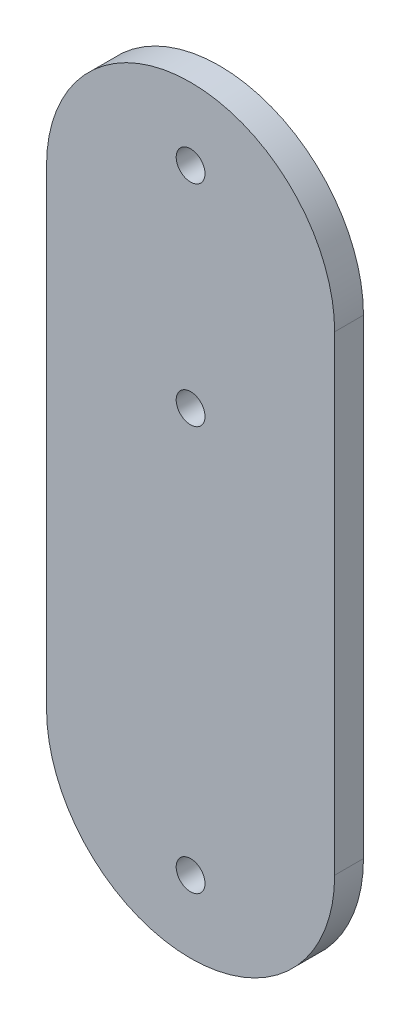
ISO-10303-21;
HEADER;
FILE_DESCRIPTION(('STEP AP214'),'2;1');
FILE_NAME('part.step','',(''),(''),'','','');
FILE_SCHEMA(('AUTOMOTIVE_DESIGN { 1 0 10303 214 1 1 1 1 }'));
ENDSEC;
DATA;
#1=APPLICATION_CONTEXT('core data for automotive mechanical design processes');
#2=APPLICATION_PROTOCOL_DEFINITION('international standard','automotive_design',2000,#1);
#3=PRODUCT_CONTEXT('',#1,'mechanical');
#4=PRODUCT('Part','Part','',(#3));
#5=PRODUCT_RELATED_PRODUCT_CATEGORY('part','',(#4));
#6=PRODUCT_DEFINITION_FORMATION('','',#4);
#7=PRODUCT_DEFINITION_CONTEXT('part definition',#1,'design');
#8=PRODUCT_DEFINITION('design','',#6,#7);
#9=PRODUCT_DEFINITION_SHAPE('','',#8);
#10=(LENGTH_UNIT() NAMED_UNIT(*) SI_UNIT(.MILLI.,.METRE.));
#11=(NAMED_UNIT(*) PLANE_ANGLE_UNIT() SI_UNIT($,.RADIAN.));
#12=(NAMED_UNIT(*) SI_UNIT($,.STERADIAN.) SOLID_ANGLE_UNIT());
#13=UNCERTAINTY_MEASURE_WITH_UNIT(LENGTH_MEASURE(1.E-05),#10,'distance_accuracy_value','');
#14=(GEOMETRIC_REPRESENTATION_CONTEXT(3) GLOBAL_UNCERTAINTY_ASSIGNED_CONTEXT((#13)) GLOBAL_UNIT_ASSIGNED_CONTEXT((#10,
#11,#12)) REPRESENTATION_CONTEXT('',''));
#15=CARTESIAN_POINT('',(0.,0.,0.));
#16=DIRECTION('',(0.,0.,1.));
#17=DIRECTION('',(1.,0.,0.));
#18=AXIS2_PLACEMENT_3D('',#15,#16,#17);
#19=CARTESIAN_POINT('',(10.,44.7499999999967,3.));
#20=DIRECTION('',(0.,0.,1.));
#21=DIRECTION('',(1.,0.,0.));
#22=AXIS2_PLACEMENT_3D('',#19,#20,#21);
#23=PLANE('',#22);
#24=CARTESIAN_POINT('',(10.,-11.75,3.));
#25=DIRECTION('',(0.,0.,1.));
#26=DIRECTION('',(1.,0.,0.));
#27=AXIS2_PLACEMENT_3D('',#24,#25,#26);
#28=CIRCLE('',#27,1.5);
#29=CARTESIAN_POINT('',(11.5,-11.75,3.));
#30=VERTEX_POINT('',#29);
#31=EDGE_CURVE('E119',#30,#30,#28,.T.);
#32=ORIENTED_EDGE('',*,*,#31,.F.);
#33=EDGE_LOOP('',(#32));
#34=FACE_BOUND('',#33,.T.);
#35=CARTESIAN_POINT('',(10.,44.7499999999967,3.));
#36=DIRECTION('',(0.,0.,1.));
#37=DIRECTION('',(1.,0.,0.));
#38=AXIS2_PLACEMENT_3D('',#35,#36,#37);
#39=CIRCLE('',#38,15.);
#40=CARTESIAN_POINT('',(25.,44.75,3.));
#41=VERTEX_POINT('',#40);
#42=CARTESIAN_POINT('',(-5.,44.75,3.));
#43=VERTEX_POINT('',#42);
#44=EDGE_CURVE('E89',#41,#43,#39,.T.);
#45=ORIENTED_EDGE('',*,*,#44,.T.);
#46=DIRECTION('',(0.,-1.,0.));
#47=VECTOR('',#46,1.);
#48=CARTESIAN_POINT('',(-5.,44.75,3.));
#49=LINE('',#48,#47);
#50=CARTESIAN_POINT('',(-4.99999999999999,-4.25,3.));
#51=VERTEX_POINT('',#50);
#52=EDGE_CURVE('E84',#43,#51,#49,.T.);
#53=ORIENTED_EDGE('',*,*,#52,.T.);
#54=CARTESIAN_POINT('',(10.,-4.24999999997817,3.));
#55=DIRECTION('',(0.,0.,1.));
#56=DIRECTION('',(1.,0.,0.));
#57=AXIS2_PLACEMENT_3D('',#54,#55,#56);
#58=CIRCLE('',#57,15.);
#59=CARTESIAN_POINT('',(25.,-4.25,3.));
#60=VERTEX_POINT('',#59);
#61=EDGE_CURVE('E87',#51,#60,#58,.T.);
#62=ORIENTED_EDGE('',*,*,#61,.T.);
#63=DIRECTION('',(0.,1.,0.));
#64=VECTOR('',#63,1.);
#65=CARTESIAN_POINT('',(25.,44.75,3.));
#66=LINE('',#65,#64);
#67=EDGE_CURVE('E54',#60,#41,#66,.T.);
#68=ORIENTED_EDGE('',*,*,#67,.T.);
#69=EDGE_LOOP('',(#45,#53,#62,#68));
#70=FACE_BOUND('',#69,.T.);
#71=CARTESIAN_POINT('',(10.,52.25,3.));
#72=DIRECTION('',(0.,0.,1.));
#73=DIRECTION('',(1.,0.,0.));
#74=AXIS2_PLACEMENT_3D('',#71,#72,#73);
#75=CIRCLE('',#74,1.5);
#76=CARTESIAN_POINT('',(11.5,52.25,3.));
#77=VERTEX_POINT('',#76);
#78=EDGE_CURVE('E104',#77,#77,#75,.T.);
#79=ORIENTED_EDGE('',*,*,#78,.F.);
#80=EDGE_LOOP('',(#79));
#81=FACE_BOUND('',#80,.T.);
#82=CARTESIAN_POINT('',(9.99999999999545,30.3600000000003,3.));
#83=DIRECTION('',(0.,0.,1.));
#84=DIRECTION('',(1.,0.,0.));
#85=AXIS2_PLACEMENT_3D('',#82,#83,#84);
#86=CIRCLE('',#85,1.5);
#87=CARTESIAN_POINT('',(11.4999999999955,30.3600000000003,3.));
#88=VERTEX_POINT('',#87);
#89=EDGE_CURVE('E125',#88,#88,#86,.T.);
#90=ORIENTED_EDGE('',*,*,#89,.F.);
#91=EDGE_LOOP('',(#90));
#92=FACE_BOUND('',#91,.T.);
#93=ADVANCED_FACE('F37',(#34,#70,#81,#92),#23,.T.);
#94=CARTESIAN_POINT('',(10.,44.7499999999967,0.));
#95=DIRECTION('',(0.,0.,1.));
#96=DIRECTION('',(1.,0.,0.));
#97=AXIS2_PLACEMENT_3D('',#94,#95,#96);
#98=PLANE('',#97);
#99=CARTESIAN_POINT('',(10.,-11.75,0.));
#100=DIRECTION('',(0.,0.,1.));
#101=DIRECTION('',(1.,0.,0.));
#102=AXIS2_PLACEMENT_3D('',#99,#100,#101);
#103=CIRCLE('',#102,1.5);
#104=CARTESIAN_POINT('',(11.5,-11.75,0.));
#105=VERTEX_POINT('',#104);
#106=EDGE_CURVE('E122',#105,#105,#103,.T.);
#107=ORIENTED_EDGE('',*,*,#106,.T.);
#108=EDGE_LOOP('',(#107));
#109=FACE_BOUND('',#108,.T.);
#110=CARTESIAN_POINT('',(10.,44.7499999999967,0.));
#111=DIRECTION('',(0.,0.,1.));
#112=DIRECTION('',(1.,0.,0.));
#113=AXIS2_PLACEMENT_3D('',#110,#111,#112);
#114=CIRCLE('',#113,15.);
#115=CARTESIAN_POINT('',(25.,44.75,0.));
#116=VERTEX_POINT('',#115);
#117=CARTESIAN_POINT('',(-5.,44.75,0.));
#118=VERTEX_POINT('',#117);
#119=EDGE_CURVE('E101',#116,#118,#114,.T.);
#120=ORIENTED_EDGE('',*,*,#119,.F.);
#121=DIRECTION('',(0.,1.,0.));
#122=VECTOR('',#121,1.);
#123=CARTESIAN_POINT('',(25.,44.75,0.));
#124=LINE('',#123,#122);
#125=CARTESIAN_POINT('',(25.,-4.25,0.));
#126=VERTEX_POINT('',#125);
#127=EDGE_CURVE('E77',#126,#116,#124,.T.);
#128=ORIENTED_EDGE('',*,*,#127,.F.);
#129=CARTESIAN_POINT('',(10.,-4.24999999997817,0.));
#130=DIRECTION('',(0.,0.,1.));
#131=DIRECTION('',(1.,0.,0.));
#132=AXIS2_PLACEMENT_3D('',#129,#130,#131);
#133=CIRCLE('',#132,15.);
#134=CARTESIAN_POINT('',(-4.99999999999999,-4.25,0.));
#135=VERTEX_POINT('',#134);
#136=EDGE_CURVE('E71',#135,#126,#133,.T.);
#137=ORIENTED_EDGE('',*,*,#136,.F.);
#138=DIRECTION('',(0.,-1.,0.));
#139=VECTOR('',#138,1.);
#140=CARTESIAN_POINT('',(-5.,44.75,0.));
#141=LINE('',#140,#139);
#142=EDGE_CURVE('E93',#118,#135,#141,.T.);
#143=ORIENTED_EDGE('',*,*,#142,.F.);
#144=EDGE_LOOP('',(#120,#128,#137,#143));
#145=FACE_BOUND('',#144,.T.);
#146=CARTESIAN_POINT('',(10.,52.25,0.));
#147=DIRECTION('',(0.,0.,1.));
#148=DIRECTION('',(1.,0.,0.));
#149=AXIS2_PLACEMENT_3D('',#146,#147,#148);
#150=CIRCLE('',#149,1.5);
#151=CARTESIAN_POINT('',(11.5,52.25,0.));
#152=VERTEX_POINT('',#151);
#153=EDGE_CURVE('E116',#152,#152,#150,.T.);
#154=ORIENTED_EDGE('',*,*,#153,.T.);
#155=EDGE_LOOP('',(#154));
#156=FACE_BOUND('',#155,.T.);
#157=CARTESIAN_POINT('',(9.99999999999545,30.3600000000003,0.));
#158=DIRECTION('',(0.,0.,1.));
#159=DIRECTION('',(1.,0.,0.));
#160=AXIS2_PLACEMENT_3D('',#157,#158,#159);
#161=CIRCLE('',#160,1.5);
#162=CARTESIAN_POINT('',(11.4999999999955,30.3600000000003,0.));
#163=VERTEX_POINT('',#162);
#164=EDGE_CURVE('E128',#163,#163,#161,.T.);
#165=ORIENTED_EDGE('',*,*,#164,.T.);
#166=EDGE_LOOP('',(#165));
#167=FACE_BOUND('',#166,.T.);
#168=ADVANCED_FACE('F112',(#109,#145,#156,#167),#98,.F.);
#169=CARTESIAN_POINT('',(10.,44.7499999999967,3.));
#170=DIRECTION('',(0.,0.,-1.));
#171=DIRECTION('',(-1.,0.,0.));
#172=AXIS2_PLACEMENT_3D('',#169,#170,#171);
#173=CYLINDRICAL_SURFACE('',#172,15.);
#174=ORIENTED_EDGE('',*,*,#119,.T.);
#175=DIRECTION('',(0.,0.,-1.));
#176=VECTOR('',#175,1.);
#177=CARTESIAN_POINT('',(-5.,44.75,3.));
#178=LINE('',#177,#176);
#179=EDGE_CURVE('E11',#43,#118,#178,.T.);
#180=ORIENTED_EDGE('',*,*,#179,.F.);
#181=ORIENTED_EDGE('',*,*,#44,.F.);
#182=DIRECTION('',(0.,0.,-1.));
#183=VECTOR('',#182,1.);
#184=CARTESIAN_POINT('',(25.,44.75,3.));
#185=LINE('',#184,#183);
#186=EDGE_CURVE('E97',#41,#116,#185,.T.);
#187=ORIENTED_EDGE('',*,*,#186,.T.);
#188=EDGE_LOOP('',(#174,#180,#181,#187));
#189=FACE_BOUND('',#188,.T.);
#190=ADVANCED_FACE('F39',(#189),#173,.T.);
#191=CARTESIAN_POINT('',(-5.,44.75,3.));
#192=DIRECTION('',(1.,0.,0.));
#193=DIRECTION('',(0.,0.,-1.));
#194=AXIS2_PLACEMENT_3D('',#191,#192,#193);
#195=PLANE('',#194);
#196=ORIENTED_EDGE('',*,*,#142,.T.);
#197=DIRECTION('',(0.,0.,-1.));
#198=VECTOR('',#197,1.);
#199=CARTESIAN_POINT('',(-4.99999999999999,-4.25,3.));
#200=LINE('',#199,#198);
#201=EDGE_CURVE('E46',#51,#135,#200,.T.);
#202=ORIENTED_EDGE('',*,*,#201,.F.);
#203=ORIENTED_EDGE('',*,*,#52,.F.);
#204=ORIENTED_EDGE('',*,*,#179,.T.);
#205=EDGE_LOOP('',(#196,#202,#203,#204));
#206=FACE_BOUND('',#205,.T.);
#207=ADVANCED_FACE('F92',(#206),#195,.F.);
#208=CARTESIAN_POINT('',(10.,-4.24999999997817,3.));
#209=DIRECTION('',(0.,0.,-1.));
#210=DIRECTION('',(-1.,0.,0.));
#211=AXIS2_PLACEMENT_3D('',#208,#209,#210);
#212=CYLINDRICAL_SURFACE('',#211,15.);
#213=ORIENTED_EDGE('',*,*,#136,.T.);
#214=DIRECTION('',(0.,0.,-1.));
#215=VECTOR('',#214,1.);
#216=CARTESIAN_POINT('',(25.,-4.25,3.));
#217=LINE('',#216,#215);
#218=EDGE_CURVE('E94',#60,#126,#217,.T.);
#219=ORIENTED_EDGE('',*,*,#218,.F.);
#220=ORIENTED_EDGE('',*,*,#61,.F.);
#221=ORIENTED_EDGE('',*,*,#201,.T.);
#222=EDGE_LOOP('',(#213,#219,#220,#221));
#223=FACE_BOUND('',#222,.T.);
#224=ADVANCED_FACE('F95',(#223),#212,.T.);
#225=CARTESIAN_POINT('',(25.,44.75,3.));
#226=DIRECTION('',(-1.,0.,0.));
#227=DIRECTION('',(0.,0.,1.));
#228=AXIS2_PLACEMENT_3D('',#225,#226,#227);
#229=PLANE('',#228);
#230=ORIENTED_EDGE('',*,*,#127,.T.);
#231=ORIENTED_EDGE('',*,*,#186,.F.);
#232=ORIENTED_EDGE('',*,*,#67,.F.);
#233=ORIENTED_EDGE('',*,*,#218,.T.);
#234=EDGE_LOOP('',(#230,#231,#232,#233));
#235=FACE_BOUND('',#234,.T.);
#236=ADVANCED_FACE('F109',(#235),#229,.F.);
#237=CARTESIAN_POINT('',(10.,52.25,3.));
#238=DIRECTION('',(0.,0.,-1.));
#239=DIRECTION('',(-1.,0.,0.));
#240=AXIS2_PLACEMENT_3D('',#237,#238,#239);
#241=CYLINDRICAL_SURFACE('',#240,1.5);
#242=ORIENTED_EDGE('',*,*,#78,.T.);
#243=EDGE_LOOP('',(#242));
#244=FACE_BOUND('',#243,.T.);
#245=ORIENTED_EDGE('',*,*,#153,.F.);
#246=EDGE_LOOP('',(#245));
#247=FACE_BOUND('',#246,.T.);
#248=ADVANCED_FACE('F147',(#244,#247),#241,.F.);
#249=CARTESIAN_POINT('',(10.,-11.75,3.));
#250=DIRECTION('',(0.,0.,-1.));
#251=DIRECTION('',(-1.,0.,0.));
#252=AXIS2_PLACEMENT_3D('',#249,#250,#251);
#253=CYLINDRICAL_SURFACE('',#252,1.5);
#254=ORIENTED_EDGE('',*,*,#31,.T.);
#255=EDGE_LOOP('',(#254));
#256=FACE_BOUND('',#255,.T.);
#257=ORIENTED_EDGE('',*,*,#106,.F.);
#258=EDGE_LOOP('',(#257));
#259=FACE_BOUND('',#258,.T.);
#260=ADVANCED_FACE('F193',(#256,#259),#253,.F.);
#261=CARTESIAN_POINT('',(9.99999999999545,30.3600000000003,3.));
#262=DIRECTION('',(0.,0.,-1.));
#263=DIRECTION('',(-1.,0.,0.));
#264=AXIS2_PLACEMENT_3D('',#261,#262,#263);
#265=CYLINDRICAL_SURFACE('',#264,1.5);
#266=ORIENTED_EDGE('',*,*,#89,.T.);
#267=EDGE_LOOP('',(#266));
#268=FACE_BOUND('',#267,.T.);
#269=ORIENTED_EDGE('',*,*,#164,.F.);
#270=EDGE_LOOP('',(#269));
#271=FACE_BOUND('',#270,.T.);
#272=ADVANCED_FACE('F134',(#268,#271),#265,.F.);
#273=CLOSED_SHELL('',(#93,#168,#190,#207,#224,#236,#248,#260,#272));
#274=MANIFOLD_SOLID_BREP('B2',#273);
#275=ADVANCED_BREP_SHAPE_REPRESENTATION('',(#18,#274),#14);
#276=SHAPE_DEFINITION_REPRESENTATION(#9,#275);
ENDSEC;
END-ISO-10303-21;
